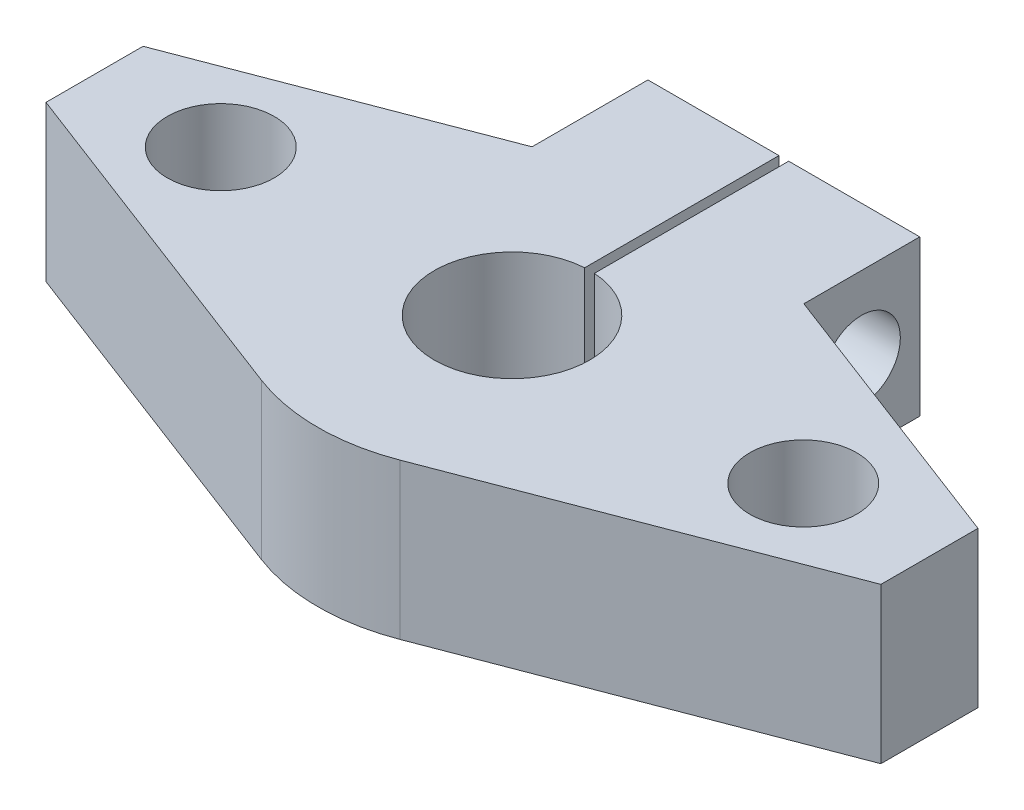
ISO-10303-21;
HEADER;
FILE_DESCRIPTION(('STEP AP214'),'2;1');
FILE_NAME('part.step','',(''),(''),'','','');
FILE_SCHEMA(('AUTOMOTIVE_DESIGN { 1 0 10303 214 1 1 1 1 }'));
ENDSEC;
DATA;
#1=APPLICATION_CONTEXT('core data for automotive mechanical design processes');
#2=APPLICATION_PROTOCOL_DEFINITION('international standard','automotive_design',2000,#1);
#3=PRODUCT_CONTEXT('',#1,'mechanical');
#4=PRODUCT('Part','Part','',(#3));
#5=PRODUCT_RELATED_PRODUCT_CATEGORY('part','',(#4));
#6=PRODUCT_DEFINITION_FORMATION('','',#4);
#7=PRODUCT_DEFINITION_CONTEXT('part definition',#1,'design');
#8=PRODUCT_DEFINITION('design','',#6,#7);
#9=PRODUCT_DEFINITION_SHAPE('','',#8);
#10=(LENGTH_UNIT() NAMED_UNIT(*) SI_UNIT(.MILLI.,.METRE.));
#11=(NAMED_UNIT(*) PLANE_ANGLE_UNIT() SI_UNIT($,.RADIAN.));
#12=(NAMED_UNIT(*) SI_UNIT($,.STERADIAN.) SOLID_ANGLE_UNIT());
#13=UNCERTAINTY_MEASURE_WITH_UNIT(LENGTH_MEASURE(1.E-05),#10,'distance_accuracy_value','');
#14=(GEOMETRIC_REPRESENTATION_CONTEXT(3) GLOBAL_UNCERTAINTY_ASSIGNED_CONTEXT((#13)) GLOBAL_UNIT_ASSIGNED_CONTEXT((#10,
#11,#12)) REPRESENTATION_CONTEXT('',''));
#15=CARTESIAN_POINT('',(0.,0.,0.));
#16=DIRECTION('',(0.,0.,1.));
#17=DIRECTION('',(1.,0.,0.));
#18=AXIS2_PLACEMENT_3D('',#15,#16,#17);
#19=CARTESIAN_POINT('',(0.,8.,0.));
#20=DIRECTION('',(0.,1.,0.));
#21=DIRECTION('',(0.,0.,1.));
#22=AXIS2_PLACEMENT_3D('',#19,#20,#21);
#23=PLANE('',#22);
#24=CARTESIAN_POINT('',(-15.,8.,0.));
#25=DIRECTION('',(0.,1.,0.));
#26=DIRECTION('',(0.,0.,1.));
#27=AXIS2_PLACEMENT_3D('',#24,#25,#26);
#28=CIRCLE('',#27,2.75);
#29=CARTESIAN_POINT('',(-15.,8.,2.75));
#30=VERTEX_POINT('',#29);
#31=EDGE_CURVE('E279',#30,#30,#28,.T.);
#32=ORIENTED_EDGE('',*,*,#31,.F.);
#33=EDGE_LOOP('',(#32));
#34=FACE_BOUND('',#33,.T.);
#35=CARTESIAN_POINT('',(15.,8.,0.));
#36=DIRECTION('',(0.,-1.,0.));
#37=DIRECTION('',(0.,0.,1.));
#38=AXIS2_PLACEMENT_3D('',#35,#36,#37);
#39=CIRCLE('',#38,2.75);
#40=CARTESIAN_POINT('',(15.,8.,2.75));
#41=VERTEX_POINT('',#40);
#42=EDGE_CURVE('E224',#41,#41,#39,.T.);
#43=ORIENTED_EDGE('',*,*,#42,.T.);
#44=EDGE_LOOP('',(#43));
#45=FACE_BOUND('',#44,.T.);
#46=DIRECTION('',(-1.,0.,0.));
#47=VECTOR('',#46,1.);
#48=CARTESIAN_POINT('',(0.,8.,-14.));
#49=LINE('',#48,#47);
#50=CARTESIAN_POINT('',(7.,8.,-14.));
#51=VERTEX_POINT('',#50);
#52=CARTESIAN_POINT('',(0.25,8.,-14.));
#53=VERTEX_POINT('',#52);
#54=EDGE_CURVE('E289',#51,#53,#49,.T.);
#55=ORIENTED_EDGE('',*,*,#54,.T.);
#56=DIRECTION('',(0.,0.,-1.));
#57=VECTOR('',#56,1.);
#58=CARTESIAN_POINT('',(0.25,8.,-20.));
#59=LINE('',#58,#57);
#60=CARTESIAN_POINT('',(0.25,8.,-3.99217985566783));
#61=VERTEX_POINT('',#60);
#62=EDGE_CURVE('E144',#61,#53,#59,.T.);
#63=ORIENTED_EDGE('',*,*,#62,.F.);
#64=CARTESIAN_POINT('',(0.,8.,0.));
#65=DIRECTION('',(0.,1.,0.));
#66=DIRECTION('',(0.,0.,1.));
#67=AXIS2_PLACEMENT_3D('',#64,#65,#66);
#68=CIRCLE('',#67,4.);
#69=CARTESIAN_POINT('',(-0.25,8.,-3.99217985566783));
#70=VERTEX_POINT('',#69);
#71=EDGE_CURVE('E215',#70,#61,#68,.T.);
#72=ORIENTED_EDGE('',*,*,#71,.F.);
#73=DIRECTION('',(0.,0.,1.));
#74=VECTOR('',#73,1.);
#75=CARTESIAN_POINT('',(-0.25,8.,-20.));
#76=LINE('',#75,#74);
#77=CARTESIAN_POINT('',(-0.25,8.,-14.));
#78=VERTEX_POINT('',#77);
#79=EDGE_CURVE('E65',#78,#70,#76,.T.);
#80=ORIENTED_EDGE('',*,*,#79,.F.);
#81=CARTESIAN_POINT('',(-7.,8.,-14.));
#82=VERTEX_POINT('',#81);
#83=EDGE_CURVE('E288',#78,#82,#49,.T.);
#84=ORIENTED_EDGE('',*,*,#83,.T.);
#85=DIRECTION('',(0.,0.,1.));
#86=VECTOR('',#85,1.);
#87=CARTESIAN_POINT('',(-7.,8.,-14.));
#88=LINE('',#87,#86);
#89=CARTESIAN_POINT('',(-7.,8.,-8.03235694676496));
#90=VERTEX_POINT('',#89);
#91=EDGE_CURVE('E292',#82,#90,#88,.T.);
#92=ORIENTED_EDGE('',*,*,#91,.T.);
#93=DIRECTION('',(-0.93430439090657,0.,0.356476233615515));
#94=VECTOR('',#93,1.);
#95=CARTESIAN_POINT('',(-21.5,8.,-2.5));
#96=LINE('',#95,#94);
#97=CARTESIAN_POINT('',(-21.5,8.,-2.5));
#98=VERTEX_POINT('',#97);
#99=EDGE_CURVE('E295',#90,#98,#96,.T.);
#100=ORIENTED_EDGE('',*,*,#99,.T.);
#101=DIRECTION('',(0.,0.,1.));
#102=VECTOR('',#101,1.);
#103=CARTESIAN_POINT('',(-21.5,8.,-2.5));
#104=LINE('',#103,#102);
#105=CARTESIAN_POINT('',(-21.5,8.,2.5));
#106=VERTEX_POINT('',#105);
#107=EDGE_CURVE('E298',#98,#106,#104,.T.);
#108=ORIENTED_EDGE('',*,*,#107,.T.);
#109=DIRECTION('',(0.93430439090657,0.,0.356476233615515));
#110=VECTOR('',#109,1.);
#111=CARTESIAN_POINT('',(-21.5,8.,2.5));
#112=LINE('',#111,#110);
#113=CARTESIAN_POINT('',(-3.56476233615515,8.,9.3430439090657));
#114=VERTEX_POINT('',#113);
#115=EDGE_CURVE('E194',#106,#114,#112,.T.);
#116=ORIENTED_EDGE('',*,*,#115,.T.);
#117=CARTESIAN_POINT('',(0.,8.,0.));
#118=DIRECTION('',(0.,1.,0.));
#119=DIRECTION('',(0.,0.,1.));
#120=AXIS2_PLACEMENT_3D('',#117,#118,#119);
#121=CIRCLE('',#120,10.);
#122=CARTESIAN_POINT('',(3.56476233615515,8.,9.3430439090657));
#123=VERTEX_POINT('',#122);
#124=EDGE_CURVE('E188',#114,#123,#121,.T.);
#125=ORIENTED_EDGE('',*,*,#124,.T.);
#126=DIRECTION('',(-0.93430439090657,0.,0.356476233615515));
#127=VECTOR('',#126,1.);
#128=CARTESIAN_POINT('',(21.5,8.,2.5));
#129=LINE('',#128,#127);
#130=CARTESIAN_POINT('',(21.5,8.,2.5));
#131=VERTEX_POINT('',#130);
#132=EDGE_CURVE('E233',#131,#123,#129,.T.);
#133=ORIENTED_EDGE('',*,*,#132,.F.);
#134=DIRECTION('',(0.,0.,1.));
#135=VECTOR('',#134,1.);
#136=CARTESIAN_POINT('',(21.5,8.,-2.5));
#137=LINE('',#136,#135);
#138=CARTESIAN_POINT('',(21.5,8.,-2.5));
#139=VERTEX_POINT('',#138);
#140=EDGE_CURVE('E237',#139,#131,#137,.T.);
#141=ORIENTED_EDGE('',*,*,#140,.F.);
#142=DIRECTION('',(0.93430439090657,0.,0.356476233615515));
#143=VECTOR('',#142,1.);
#144=CARTESIAN_POINT('',(21.5,8.,-2.5));
#145=LINE('',#144,#143);
#146=CARTESIAN_POINT('',(7.,8.,-8.03235694676496));
#147=VERTEX_POINT('',#146);
#148=EDGE_CURVE('E242',#147,#139,#145,.T.);
#149=ORIENTED_EDGE('',*,*,#148,.F.);
#150=DIRECTION('',(0.,0.,1.));
#151=VECTOR('',#150,1.);
#152=CARTESIAN_POINT('',(7.,8.,-14.));
#153=LINE('',#152,#151);
#154=EDGE_CURVE('E246',#51,#147,#153,.T.);
#155=ORIENTED_EDGE('',*,*,#154,.F.);
#156=EDGE_LOOP('',(#55,#63,#72,#80,#84,#92,#100,#108,#116,#125,#133,#141,#149,#155));
#157=FACE_BOUND('',#156,.T.);
#158=ADVANCED_FACE('F41',(#34,#45,#157),#23,.T.);
#159=CARTESIAN_POINT('',(0.,0.,0.));
#160=DIRECTION('',(0.,1.,0.));
#161=DIRECTION('',(0.,0.,1.));
#162=AXIS2_PLACEMENT_3D('',#159,#160,#161);
#163=PLANE('',#162);
#164=CARTESIAN_POINT('',(15.,0.,0.));
#165=DIRECTION('',(0.,-1.,0.));
#166=DIRECTION('',(0.,0.,1.));
#167=AXIS2_PLACEMENT_3D('',#164,#165,#166);
#168=CIRCLE('',#167,2.75);
#169=CARTESIAN_POINT('',(15.,0.,2.75));
#170=VERTEX_POINT('',#169);
#171=EDGE_CURVE('E219',#170,#170,#168,.T.);
#172=ORIENTED_EDGE('',*,*,#171,.F.);
#173=EDGE_LOOP('',(#172));
#174=FACE_BOUND('',#173,.T.);
#175=CARTESIAN_POINT('',(-15.,0.,0.));
#176=DIRECTION('',(0.,1.,0.));
#177=DIRECTION('',(0.,0.,1.));
#178=AXIS2_PLACEMENT_3D('',#175,#176,#177);
#179=CIRCLE('',#178,2.75);
#180=CARTESIAN_POINT('',(-15.,0.,2.75));
#181=VERTEX_POINT('',#180);
#182=EDGE_CURVE('E278',#181,#181,#179,.T.);
#183=ORIENTED_EDGE('',*,*,#182,.T.);
#184=EDGE_LOOP('',(#183));
#185=FACE_BOUND('',#184,.T.);
#186=DIRECTION('',(0.,0.,-1.));
#187=VECTOR('',#186,1.);
#188=CARTESIAN_POINT('',(0.25,0.,-20.));
#189=LINE('',#188,#187);
#190=CARTESIAN_POINT('',(0.25,0.,-3.99217985566783));
#191=VERTEX_POINT('',#190);
#192=CARTESIAN_POINT('',(0.25,0.,-14.));
#193=VERTEX_POINT('',#192);
#194=EDGE_CURVE('E58',#191,#193,#189,.T.);
#195=ORIENTED_EDGE('',*,*,#194,.T.);
#196=DIRECTION('',(-1.,0.,0.));
#197=VECTOR('',#196,1.);
#198=CARTESIAN_POINT('',(0.,0.,-14.));
#199=LINE('',#198,#197);
#200=CARTESIAN_POINT('',(7.,0.,-14.));
#201=VERTEX_POINT('',#200);
#202=EDGE_CURVE('E156',#201,#193,#199,.T.);
#203=ORIENTED_EDGE('',*,*,#202,.F.);
#204=DIRECTION('',(0.,0.,1.));
#205=VECTOR('',#204,1.);
#206=CARTESIAN_POINT('',(7.,0.,-14.));
#207=LINE('',#206,#205);
#208=CARTESIAN_POINT('',(7.,0.,-8.03235694676496));
#209=VERTEX_POINT('',#208);
#210=EDGE_CURVE('E238',#201,#209,#207,.T.);
#211=ORIENTED_EDGE('',*,*,#210,.T.);
#212=DIRECTION('',(0.93430439090657,0.,0.356476233615515));
#213=VECTOR('',#212,1.);
#214=CARTESIAN_POINT('',(21.5,0.,-2.5));
#215=LINE('',#214,#213);
#216=CARTESIAN_POINT('',(21.5,0.,-2.5));
#217=VERTEX_POINT('',#216);
#218=EDGE_CURVE('E257',#209,#217,#215,.T.);
#219=ORIENTED_EDGE('',*,*,#218,.T.);
#220=DIRECTION('',(0.,0.,1.));
#221=VECTOR('',#220,1.);
#222=CARTESIAN_POINT('',(21.5,0.,-2.5));
#223=LINE('',#222,#221);
#224=CARTESIAN_POINT('',(21.5,0.,2.5));
#225=VERTEX_POINT('',#224);
#226=EDGE_CURVE('E253',#217,#225,#223,.T.);
#227=ORIENTED_EDGE('',*,*,#226,.T.);
#228=DIRECTION('',(-0.93430439090657,0.,0.356476233615515));
#229=VECTOR('',#228,1.);
#230=CARTESIAN_POINT('',(21.5,0.,2.5));
#231=LINE('',#230,#229);
#232=CARTESIAN_POINT('',(3.56476233615515,0.,9.3430439090657));
#233=VERTEX_POINT('',#232);
#234=EDGE_CURVE('E231',#225,#233,#231,.T.);
#235=ORIENTED_EDGE('',*,*,#234,.T.);
#236=CARTESIAN_POINT('',(0.,0.,0.));
#237=DIRECTION('',(0.,1.,0.));
#238=DIRECTION('',(0.,0.,1.));
#239=AXIS2_PLACEMENT_3D('',#236,#237,#238);
#240=CIRCLE('',#239,10.);
#241=CARTESIAN_POINT('',(-3.56476233615515,0.,9.3430439090657));
#242=VERTEX_POINT('',#241);
#243=EDGE_CURVE('E176',#242,#233,#240,.T.);
#244=ORIENTED_EDGE('',*,*,#243,.F.);
#245=DIRECTION('',(0.93430439090657,0.,0.356476233615515));
#246=VECTOR('',#245,1.);
#247=CARTESIAN_POINT('',(-21.5,0.,2.5));
#248=LINE('',#247,#246);
#249=CARTESIAN_POINT('',(-21.5,0.,2.5));
#250=VERTEX_POINT('',#249);
#251=EDGE_CURVE('E185',#250,#242,#248,.T.);
#252=ORIENTED_EDGE('',*,*,#251,.F.);
#253=DIRECTION('',(0.,0.,1.));
#254=VECTOR('',#253,1.);
#255=CARTESIAN_POINT('',(-21.5,0.,-2.5));
#256=LINE('',#255,#254);
#257=CARTESIAN_POINT('',(-21.5,0.,-2.5));
#258=VERTEX_POINT('',#257);
#259=EDGE_CURVE('E182',#258,#250,#256,.T.);
#260=ORIENTED_EDGE('',*,*,#259,.F.);
#261=DIRECTION('',(-0.93430439090657,0.,0.356476233615515));
#262=VECTOR('',#261,1.);
#263=CARTESIAN_POINT('',(-21.5,0.,-2.5));
#264=LINE('',#263,#262);
#265=CARTESIAN_POINT('',(-7.,0.,-8.03235694676496));
#266=VERTEX_POINT('',#265);
#267=EDGE_CURVE('E174',#266,#258,#264,.T.);
#268=ORIENTED_EDGE('',*,*,#267,.F.);
#269=DIRECTION('',(0.,0.,1.));
#270=VECTOR('',#269,1.);
#271=CARTESIAN_POINT('',(-7.,0.,-14.));
#272=LINE('',#271,#270);
#273=CARTESIAN_POINT('',(-7.,0.,-14.));
#274=VERTEX_POINT('',#273);
#275=EDGE_CURVE('E169',#274,#266,#272,.T.);
#276=ORIENTED_EDGE('',*,*,#275,.F.);
#277=CARTESIAN_POINT('',(-0.25,0.,-14.));
#278=VERTEX_POINT('',#277);
#279=EDGE_CURVE('E170',#278,#274,#199,.T.);
#280=ORIENTED_EDGE('',*,*,#279,.F.);
#281=DIRECTION('',(0.,0.,1.));
#282=VECTOR('',#281,1.);
#283=CARTESIAN_POINT('',(-0.25,0.,-20.));
#284=LINE('',#283,#282);
#285=CARTESIAN_POINT('',(-0.25,0.,-3.99217985566783));
#286=VERTEX_POINT('',#285);
#287=EDGE_CURVE('E161',#278,#286,#284,.T.);
#288=ORIENTED_EDGE('',*,*,#287,.T.);
#289=CARTESIAN_POINT('',(0.,0.,0.));
#290=DIRECTION('',(0.,1.,0.));
#291=DIRECTION('',(0.,0.,1.));
#292=AXIS2_PLACEMENT_3D('',#289,#290,#291);
#293=CIRCLE('',#292,4.);
#294=EDGE_CURVE('E149',#286,#191,#293,.T.);
#295=ORIENTED_EDGE('',*,*,#294,.T.);
#296=EDGE_LOOP('',(#195,#203,#211,#219,#227,#235,#244,#252,#260,#268,#276,#280,#288,#295));
#297=FACE_BOUND('',#296,.T.);
#298=ADVANCED_FACE('F154',(#174,#185,#297),#163,.F.);
#299=CARTESIAN_POINT('',(0.,8.,-14.));
#300=DIRECTION('',(0.,0.,1.));
#301=DIRECTION('',(1.,0.,0.));
#302=AXIS2_PLACEMENT_3D('',#299,#300,#301);
#303=PLANE('',#302);
#304=DIRECTION('',(0.,-1.,0.));
#305=VECTOR('',#304,1.);
#306=CARTESIAN_POINT('',(0.25,8.,-14.));
#307=LINE('',#306,#305);
#308=EDGE_CURVE('E141',#53,#193,#307,.T.);
#309=ORIENTED_EDGE('',*,*,#308,.F.);
#310=ORIENTED_EDGE('',*,*,#54,.F.);
#311=DIRECTION('',(0.,-1.,0.));
#312=VECTOR('',#311,1.);
#313=CARTESIAN_POINT('',(7.,8.,-14.));
#314=LINE('',#313,#312);
#315=EDGE_CURVE('E166',#51,#201,#314,.T.);
#316=ORIENTED_EDGE('',*,*,#315,.T.);
#317=ORIENTED_EDGE('',*,*,#202,.T.);
#318=EDGE_LOOP('',(#309,#310,#316,#317));
#319=FACE_BOUND('',#318,.T.);
#320=ADVANCED_FACE('F164',(#319),#303,.F.);
#321=DIRECTION('',(0.,1.,0.));
#322=VECTOR('',#321,1.);
#323=CARTESIAN_POINT('',(-0.25,8.,-14.));
#324=LINE('',#323,#322);
#325=EDGE_CURVE('E150',#278,#78,#324,.T.);
#326=ORIENTED_EDGE('',*,*,#325,.F.);
#327=ORIENTED_EDGE('',*,*,#279,.T.);
#328=DIRECTION('',(0.,-1.,0.));
#329=VECTOR('',#328,1.);
#330=CARTESIAN_POINT('',(-7.,8.,-14.));
#331=LINE('',#330,#329);
#332=EDGE_CURVE('E206',#82,#274,#331,.T.);
#333=ORIENTED_EDGE('',*,*,#332,.F.);
#334=ORIENTED_EDGE('',*,*,#83,.F.);
#335=EDGE_LOOP('',(#326,#327,#333,#334));
#336=FACE_BOUND('',#335,.T.);
#337=ADVANCED_FACE('F345',(#336),#303,.F.);
#338=CARTESIAN_POINT('',(0.,8.,0.));
#339=DIRECTION('',(0.,-1.,0.));
#340=DIRECTION('',(0.,0.,-1.));
#341=AXIS2_PLACEMENT_3D('',#338,#339,#340);
#342=CYLINDRICAL_SURFACE('',#341,4.);
#343=ORIENTED_EDGE('',*,*,#71,.T.);
#344=DIRECTION('',(0.,-1.,0.));
#345=VECTOR('',#344,1.);
#346=CARTESIAN_POINT('',(0.25,8.,-3.99217985566783));
#347=LINE('',#346,#345);
#348=EDGE_CURVE('E11',#61,#191,#347,.T.);
#349=ORIENTED_EDGE('',*,*,#348,.T.);
#350=ORIENTED_EDGE('',*,*,#294,.F.);
#351=DIRECTION('',(0.,-1.,0.));
#352=VECTOR('',#351,1.);
#353=CARTESIAN_POINT('',(-0.25,8.,-3.99217985566783));
#354=LINE('',#353,#352);
#355=EDGE_CURVE('E51',#286,#70,#354,.F.);
#356=ORIENTED_EDGE('',*,*,#355,.T.);
#357=EDGE_LOOP('',(#343,#349,#350,#356));
#358=FACE_BOUND('',#357,.T.);
#359=ADVANCED_FACE('F214',(#358),#342,.F.);
#360=CARTESIAN_POINT('',(0.,8.,0.));
#361=DIRECTION('',(0.,-1.,0.));
#362=DIRECTION('',(0.,0.,-1.));
#363=AXIS2_PLACEMENT_3D('',#360,#361,#362);
#364=CYLINDRICAL_SURFACE('',#363,10.);
#365=ORIENTED_EDGE('',*,*,#243,.T.);
#366=DIRECTION('',(0.,-1.,0.));
#367=VECTOR('',#366,1.);
#368=CARTESIAN_POINT('',(3.56476233615515,8.,9.3430439090657));
#369=LINE('',#368,#367);
#370=EDGE_CURVE('E274',#123,#233,#369,.T.);
#371=ORIENTED_EDGE('',*,*,#370,.F.);
#372=ORIENTED_EDGE('',*,*,#124,.F.);
#373=DIRECTION('',(0.,-1.,0.));
#374=VECTOR('',#373,1.);
#375=CARTESIAN_POINT('',(-3.56476233615515,8.,9.3430439090657));
#376=LINE('',#375,#374);
#377=EDGE_CURVE('E189',#114,#242,#376,.T.);
#378=ORIENTED_EDGE('',*,*,#377,.T.);
#379=EDGE_LOOP('',(#365,#371,#372,#378));
#380=FACE_BOUND('',#379,.T.);
#381=ADVANCED_FACE('F43',(#380),#364,.T.);
#382=CARTESIAN_POINT('',(-7.,8.,-14.));
#383=DIRECTION('',(1.,0.,0.));
#384=DIRECTION('',(0.,0.,-1.));
#385=AXIS2_PLACEMENT_3D('',#382,#383,#384);
#386=PLANE('',#385);
#387=CARTESIAN_POINT('',(-7.,4.,-11.));
#388=DIRECTION('',(1.,0.,0.));
#389=DIRECTION('',(0.,0.,-1.));
#390=AXIS2_PLACEMENT_3D('',#387,#388,#389);
#391=CIRCLE('',#390,2.);
#392=CARTESIAN_POINT('',(-7.,4.,-13.));
#393=VERTEX_POINT('',#392);
#394=EDGE_CURVE('E162',#393,#393,#391,.T.);
#395=ORIENTED_EDGE('',*,*,#394,.T.);
#396=EDGE_LOOP('',(#395));
#397=FACE_BOUND('',#396,.T.);
#398=ORIENTED_EDGE('',*,*,#275,.T.);
#399=DIRECTION('',(0.,-1.,0.));
#400=VECTOR('',#399,1.);
#401=CARTESIAN_POINT('',(-7.,8.,-8.03235694676496));
#402=LINE('',#401,#400);
#403=EDGE_CURVE('E202',#90,#266,#402,.T.);
#404=ORIENTED_EDGE('',*,*,#403,.F.);
#405=ORIENTED_EDGE('',*,*,#91,.F.);
#406=ORIENTED_EDGE('',*,*,#332,.T.);
#407=EDGE_LOOP('',(#398,#404,#405,#406));
#408=FACE_BOUND('',#407,.T.);
#409=ADVANCED_FACE('F340',(#397,#408),#386,.F.);
#410=CARTESIAN_POINT('',(-21.5,8.,-2.5));
#411=DIRECTION('',(0.356476233615515,0.,0.93430439090657));
#412=DIRECTION('',(0.93430439090657,0.,-0.356476233615515));
#413=AXIS2_PLACEMENT_3D('',#410,#411,#412);
#414=PLANE('',#413);
#415=ORIENTED_EDGE('',*,*,#267,.T.);
#416=DIRECTION('',(0.,-1.,0.));
#417=VECTOR('',#416,1.);
#418=CARTESIAN_POINT('',(-21.5,8.,-2.5));
#419=LINE('',#418,#417);
#420=EDGE_CURVE('E198',#98,#258,#419,.T.);
#421=ORIENTED_EDGE('',*,*,#420,.F.);
#422=ORIENTED_EDGE('',*,*,#99,.F.);
#423=ORIENTED_EDGE('',*,*,#403,.T.);
#424=EDGE_LOOP('',(#415,#421,#422,#423));
#425=FACE_BOUND('',#424,.T.);
#426=ADVANCED_FACE('F336',(#425),#414,.F.);
#427=CARTESIAN_POINT('',(-21.5,8.,-2.5));
#428=DIRECTION('',(1.,0.,0.));
#429=DIRECTION('',(0.,0.,-1.));
#430=AXIS2_PLACEMENT_3D('',#427,#428,#429);
#431=PLANE('',#430);
#432=ORIENTED_EDGE('',*,*,#259,.T.);
#433=DIRECTION('',(0.,-1.,0.));
#434=VECTOR('',#433,1.);
#435=CARTESIAN_POINT('',(-21.5,8.,2.5));
#436=LINE('',#435,#434);
#437=EDGE_CURVE('E193',#106,#250,#436,.T.);
#438=ORIENTED_EDGE('',*,*,#437,.F.);
#439=ORIENTED_EDGE('',*,*,#107,.F.);
#440=ORIENTED_EDGE('',*,*,#420,.T.);
#441=EDGE_LOOP('',(#432,#438,#439,#440));
#442=FACE_BOUND('',#441,.T.);
#443=ADVANCED_FACE('F332',(#442),#431,.F.);
#444=CARTESIAN_POINT('',(-21.5,8.,2.5));
#445=DIRECTION('',(0.356476233615515,0.,-0.93430439090657));
#446=DIRECTION('',(-0.93430439090657,0.,-0.356476233615515));
#447=AXIS2_PLACEMENT_3D('',#444,#445,#446);
#448=PLANE('',#447);
#449=ORIENTED_EDGE('',*,*,#251,.T.);
#450=ORIENTED_EDGE('',*,*,#377,.F.);
#451=ORIENTED_EDGE('',*,*,#115,.F.);
#452=ORIENTED_EDGE('',*,*,#437,.T.);
#453=EDGE_LOOP('',(#449,#450,#451,#452));
#454=FACE_BOUND('',#453,.T.);
#455=ADVANCED_FACE('F309',(#454),#448,.F.);
#456=CARTESIAN_POINT('',(-15.,8.,0.));
#457=DIRECTION('',(0.,-1.,0.));
#458=DIRECTION('',(0.,0.,-1.));
#459=AXIS2_PLACEMENT_3D('',#456,#457,#458);
#460=CYLINDRICAL_SURFACE('',#459,2.75);
#461=ORIENTED_EDGE('',*,*,#31,.T.);
#462=EDGE_LOOP('',(#461));
#463=FACE_BOUND('',#462,.T.);
#464=ORIENTED_EDGE('',*,*,#182,.F.);
#465=EDGE_LOOP('',(#464));
#466=FACE_BOUND('',#465,.T.);
#467=ADVANCED_FACE('F396',(#463,#466),#460,.F.);
#468=CARTESIAN_POINT('',(21.5,8.,2.5));
#469=DIRECTION('',(0.356476233615515,0.,0.93430439090657));
#470=DIRECTION('',(0.93430439090657,0.,-0.356476233615515));
#471=AXIS2_PLACEMENT_3D('',#468,#469,#470);
#472=PLANE('',#471);
#473=ORIENTED_EDGE('',*,*,#234,.F.);
#474=DIRECTION('',(0.,-1.,0.));
#475=VECTOR('',#474,1.);
#476=CARTESIAN_POINT('',(21.5,8.,2.5));
#477=LINE('',#476,#475);
#478=EDGE_CURVE('E271',#131,#225,#477,.T.);
#479=ORIENTED_EDGE('',*,*,#478,.F.);
#480=ORIENTED_EDGE('',*,*,#132,.T.);
#481=ORIENTED_EDGE('',*,*,#370,.T.);
#482=EDGE_LOOP('',(#473,#479,#480,#481));
#483=FACE_BOUND('',#482,.T.);
#484=ADVANCED_FACE('F315',(#483),#472,.T.);
#485=CARTESIAN_POINT('',(21.5,8.,-2.5));
#486=DIRECTION('',(1.,0.,0.));
#487=DIRECTION('',(0.,0.,-1.));
#488=AXIS2_PLACEMENT_3D('',#485,#486,#487);
#489=PLANE('',#488);
#490=ORIENTED_EDGE('',*,*,#226,.F.);
#491=DIRECTION('',(0.,-1.,0.));
#492=VECTOR('',#491,1.);
#493=CARTESIAN_POINT('',(21.5,8.,-2.5));
#494=LINE('',#493,#492);
#495=EDGE_CURVE('E268',#139,#217,#494,.T.);
#496=ORIENTED_EDGE('',*,*,#495,.F.);
#497=ORIENTED_EDGE('',*,*,#140,.T.);
#498=ORIENTED_EDGE('',*,*,#478,.T.);
#499=EDGE_LOOP('',(#490,#496,#497,#498));
#500=FACE_BOUND('',#499,.T.);
#501=ADVANCED_FACE('F320',(#500),#489,.T.);
#502=CARTESIAN_POINT('',(21.5,8.,-2.5));
#503=DIRECTION('',(0.356476233615515,0.,-0.93430439090657));
#504=DIRECTION('',(-0.93430439090657,0.,-0.356476233615515));
#505=AXIS2_PLACEMENT_3D('',#502,#503,#504);
#506=PLANE('',#505);
#507=ORIENTED_EDGE('',*,*,#218,.F.);
#508=DIRECTION('',(0.,-1.,0.));
#509=VECTOR('',#508,1.);
#510=CARTESIAN_POINT('',(7.,8.,-8.03235694676496));
#511=LINE('',#510,#509);
#512=EDGE_CURVE('E265',#147,#209,#511,.T.);
#513=ORIENTED_EDGE('',*,*,#512,.F.);
#514=ORIENTED_EDGE('',*,*,#148,.T.);
#515=ORIENTED_EDGE('',*,*,#495,.T.);
#516=EDGE_LOOP('',(#507,#513,#514,#515));
#517=FACE_BOUND('',#516,.T.);
#518=ADVANCED_FACE('F323',(#517),#506,.T.);
#519=CARTESIAN_POINT('',(7.,8.,-14.));
#520=DIRECTION('',(1.,0.,0.));
#521=DIRECTION('',(0.,0.,-1.));
#522=AXIS2_PLACEMENT_3D('',#519,#520,#521);
#523=PLANE('',#522);
#524=CARTESIAN_POINT('',(7.,4.,-11.));
#525=DIRECTION('',(1.,0.,0.));
#526=DIRECTION('',(0.,0.,-1.));
#527=AXIS2_PLACEMENT_3D('',#524,#525,#526);
#528=CIRCLE('',#527,2.);
#529=CARTESIAN_POINT('',(7.,4.,-13.));
#530=VERTEX_POINT('',#529);
#531=EDGE_CURVE('E361',#530,#530,#528,.T.);
#532=ORIENTED_EDGE('',*,*,#531,.F.);
#533=EDGE_LOOP('',(#532));
#534=FACE_BOUND('',#533,.T.);
#535=ORIENTED_EDGE('',*,*,#210,.F.);
#536=ORIENTED_EDGE('',*,*,#315,.F.);
#537=ORIENTED_EDGE('',*,*,#154,.T.);
#538=ORIENTED_EDGE('',*,*,#512,.T.);
#539=EDGE_LOOP('',(#535,#536,#537,#538));
#540=FACE_BOUND('',#539,.T.);
#541=ADVANCED_FACE('F326',(#534,#540),#523,.T.);
#542=CARTESIAN_POINT('',(15.,8.,0.));
#543=DIRECTION('',(0.,-1.,0.));
#544=DIRECTION('',(0.,0.,-1.));
#545=AXIS2_PLACEMENT_3D('',#542,#543,#544);
#546=CYLINDRICAL_SURFACE('',#545,2.75);
#547=ORIENTED_EDGE('',*,*,#42,.F.);
#548=EDGE_LOOP('',(#547));
#549=FACE_BOUND('',#548,.T.);
#550=ORIENTED_EDGE('',*,*,#171,.T.);
#551=EDGE_LOOP('',(#550));
#552=FACE_BOUND('',#551,.T.);
#553=ADVANCED_FACE('F381',(#549,#552),#546,.F.);
#554=CARTESIAN_POINT('',(-0.25,8.,-20.));
#555=DIRECTION('',(1.,0.,0.));
#556=DIRECTION('',(0.,0.,-1.));
#557=AXIS2_PLACEMENT_3D('',#554,#555,#556);
#558=PLANE('',#557);
#559=CARTESIAN_POINT('',(-0.25,4.,-11.));
#560=DIRECTION('',(1.,0.,0.));
#561=DIRECTION('',(0.,0.,-1.));
#562=AXIS2_PLACEMENT_3D('',#559,#560,#561);
#563=CIRCLE('',#562,2.);
#564=CARTESIAN_POINT('',(-0.25,4.,-13.));
#565=VERTEX_POINT('',#564);
#566=EDGE_CURVE('E357',#565,#565,#563,.T.);
#567=ORIENTED_EDGE('',*,*,#566,.F.);
#568=EDGE_LOOP('',(#567));
#569=FACE_BOUND('',#568,.T.);
#570=ORIENTED_EDGE('',*,*,#325,.T.);
#571=ORIENTED_EDGE('',*,*,#79,.T.);
#572=ORIENTED_EDGE('',*,*,#355,.F.);
#573=ORIENTED_EDGE('',*,*,#287,.F.);
#574=EDGE_LOOP('',(#570,#571,#572,#573));
#575=FACE_BOUND('',#574,.T.);
#576=ADVANCED_FACE('F373',(#569,#575),#558,.T.);
#577=CARTESIAN_POINT('',(0.25,8.,-20.));
#578=DIRECTION('',(-1.,0.,0.));
#579=DIRECTION('',(0.,0.,1.));
#580=AXIS2_PLACEMENT_3D('',#577,#578,#579);
#581=PLANE('',#580);
#582=CARTESIAN_POINT('',(0.25,4.,-11.));
#583=DIRECTION('',(-1.,0.,0.));
#584=DIRECTION('',(0.,0.,1.));
#585=AXIS2_PLACEMENT_3D('',#582,#583,#584);
#586=CIRCLE('',#585,2.);
#587=CARTESIAN_POINT('',(0.25,4.,-9.));
#588=VERTEX_POINT('',#587);
#589=EDGE_CURVE('E45',#588,#588,#586,.T.);
#590=ORIENTED_EDGE('',*,*,#589,.F.);
#591=EDGE_LOOP('',(#590));
#592=FACE_BOUND('',#591,.T.);
#593=ORIENTED_EDGE('',*,*,#308,.T.);
#594=ORIENTED_EDGE('',*,*,#194,.F.);
#595=ORIENTED_EDGE('',*,*,#348,.F.);
#596=ORIENTED_EDGE('',*,*,#62,.T.);
#597=EDGE_LOOP('',(#593,#594,#595,#596));
#598=FACE_BOUND('',#597,.T.);
#599=ADVANCED_FACE('F142',(#592,#598),#581,.T.);
#600=CARTESIAN_POINT('',(-21.5,4.,-11.));
#601=DIRECTION('',(1.,0.,0.));
#602=DIRECTION('',(0.,0.,-1.));
#603=AXIS2_PLACEMENT_3D('',#600,#601,#602);
#604=CYLINDRICAL_SURFACE('',#603,2.);
#605=ORIENTED_EDGE('',*,*,#589,.T.);
#606=EDGE_LOOP('',(#605));
#607=FACE_BOUND('',#606,.T.);
#608=ORIENTED_EDGE('',*,*,#531,.T.);
#609=EDGE_LOOP('',(#608));
#610=FACE_BOUND('',#609,.T.);
#611=ADVANCED_FACE('F370',(#607,#610),#604,.F.);
#612=ORIENTED_EDGE('',*,*,#566,.T.);
#613=EDGE_LOOP('',(#612));
#614=FACE_BOUND('',#613,.T.);
#615=ORIENTED_EDGE('',*,*,#394,.F.);
#616=EDGE_LOOP('',(#615));
#617=FACE_BOUND('',#616,.T.);
#618=ADVANCED_FACE('F379',(#614,#617),#604,.F.);
#619=CLOSED_SHELL('',(#158,#298,#320,#337,#359,#381,#409,#426,#443,#455,#467,#484,#501,#518,
#541,#553,#576,#599,#611,#618));
#620=MANIFOLD_SOLID_BREP('B2',#619);
#621=ADVANCED_BREP_SHAPE_REPRESENTATION('',(#18,#620),#14);
#622=SHAPE_DEFINITION_REPRESENTATION(#9,#621);
ENDSEC;
END-ISO-10303-21;
